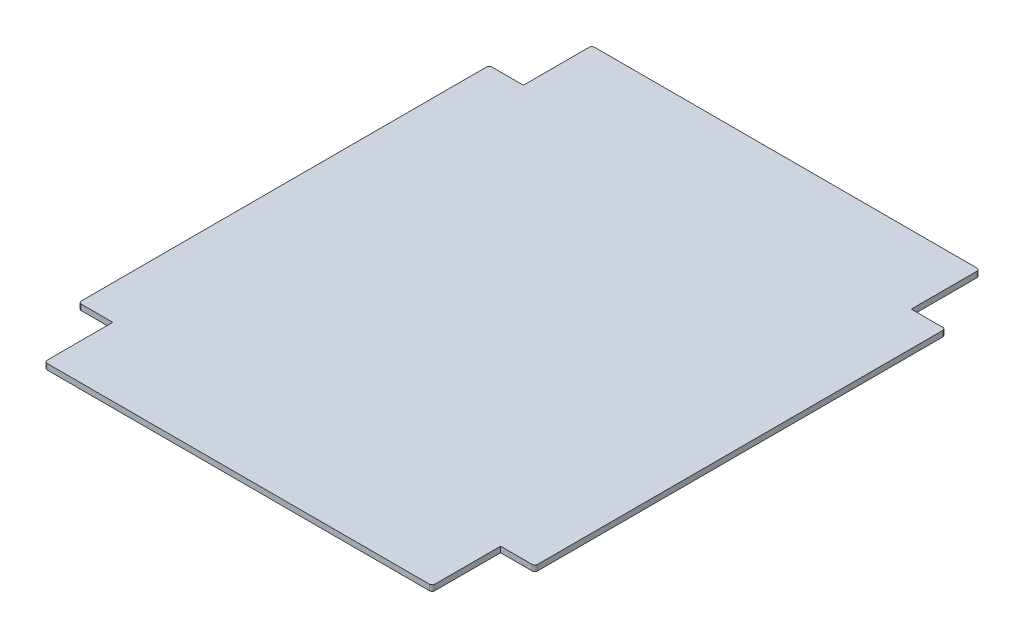
ISO-10303-21;
HEADER;
FILE_DESCRIPTION(('STEP AP214'),'2;1');
FILE_NAME('part.step','',(''),(''),'','','');
FILE_SCHEMA(('AUTOMOTIVE_DESIGN { 1 0 10303 214 1 1 1 1 }'));
ENDSEC;
DATA;
#1=APPLICATION_CONTEXT('core data for automotive mechanical design processes');
#2=APPLICATION_PROTOCOL_DEFINITION('international standard','automotive_design',2000,#1);
#3=PRODUCT_CONTEXT('',#1,'mechanical');
#4=PRODUCT('Part','Part','',(#3));
#5=PRODUCT_RELATED_PRODUCT_CATEGORY('part','',(#4));
#6=PRODUCT_DEFINITION_FORMATION('','',#4);
#7=PRODUCT_DEFINITION_CONTEXT('part definition',#1,'design');
#8=PRODUCT_DEFINITION('design','',#6,#7);
#9=PRODUCT_DEFINITION_SHAPE('','',#8);
#10=(LENGTH_UNIT() NAMED_UNIT(*) SI_UNIT(.MILLI.,.METRE.));
#11=(NAMED_UNIT(*) PLANE_ANGLE_UNIT() SI_UNIT($,.RADIAN.));
#12=(NAMED_UNIT(*) SI_UNIT($,.STERADIAN.) SOLID_ANGLE_UNIT());
#13=UNCERTAINTY_MEASURE_WITH_UNIT(LENGTH_MEASURE(1.E-05),#10,'distance_accuracy_value','');
#14=(GEOMETRIC_REPRESENTATION_CONTEXT(3) GLOBAL_UNCERTAINTY_ASSIGNED_CONTEXT((#13)) GLOBAL_UNIT_ASSIGNED_CONTEXT((#10,
#11,#12)) REPRESENTATION_CONTEXT('',''));
#15=CARTESIAN_POINT('',(0.,0.,0.));
#16=DIRECTION('',(0.,0.,1.));
#17=DIRECTION('',(1.,0.,0.));
#18=AXIS2_PLACEMENT_3D('',#15,#16,#17);
#19=CARTESIAN_POINT('',(-215.9,6.35,304.8));
#20=DIRECTION('',(1.,0.,0.));
#21=DIRECTION('',(0.,0.,-1.));
#22=AXIS2_PLACEMENT_3D('',#19,#20,#21);
#23=PLANE('',#22);
#24=DIRECTION('',(0.,0.,1.));
#25=VECTOR('',#24,1.);
#26=CARTESIAN_POINT('',(-215.9,0.,304.8));
#27=LINE('',#26,#25);
#28=CARTESIAN_POINT('',(-215.9,0.,228.6));
#29=VERTEX_POINT('',#28);
#30=CARTESIAN_POINT('',(-215.9,0.,301.625));
#31=VERTEX_POINT('',#30);
#32=EDGE_CURVE('E231',#29,#31,#27,.T.);
#33=ORIENTED_EDGE('',*,*,#32,.T.);
#34=DIRECTION('',(0.,-1.,0.));
#35=VECTOR('',#34,1.);
#36=CARTESIAN_POINT('',(-215.9,6.35,301.625));
#37=LINE('',#36,#35);
#38=CARTESIAN_POINT('',(-215.9,6.35,301.625));
#39=VERTEX_POINT('',#38);
#40=EDGE_CURVE('E329',#31,#39,#37,.F.);
#41=ORIENTED_EDGE('',*,*,#40,.T.);
#42=DIRECTION('',(0.,0.,1.));
#43=VECTOR('',#42,1.);
#44=CARTESIAN_POINT('',(-215.9,6.35,304.8));
#45=LINE('',#44,#43);
#46=CARTESIAN_POINT('',(-215.9,6.35,228.6));
#47=VERTEX_POINT('',#46);
#48=EDGE_CURVE('E260',#47,#39,#45,.T.);
#49=ORIENTED_EDGE('',*,*,#48,.F.);
#50=DIRECTION('',(0.,-1.,0.));
#51=VECTOR('',#50,1.);
#52=CARTESIAN_POINT('',(-215.9,6.35,228.6));
#53=LINE('',#52,#51);
#54=EDGE_CURVE('E230',#47,#29,#53,.T.);
#55=ORIENTED_EDGE('',*,*,#54,.T.);
#56=EDGE_LOOP('',(#33,#41,#49,#55));
#57=FACE_BOUND('',#56,.T.);
#58=ADVANCED_FACE('F43',(#57),#23,.F.);
#59=CARTESIAN_POINT('',(-215.9,6.35,304.8));
#60=DIRECTION('',(0.,0.,-1.));
#61=DIRECTION('',(-1.,0.,0.));
#62=AXIS2_PLACEMENT_3D('',#59,#60,#61);
#63=PLANE('',#62);
#64=DIRECTION('',(1.,0.,0.));
#65=VECTOR('',#64,1.);
#66=CARTESIAN_POINT('',(-215.9,6.35,304.8));
#67=LINE('',#66,#65);
#68=CARTESIAN_POINT('',(-212.725,6.35,304.8));
#69=VERTEX_POINT('',#68);
#70=CARTESIAN_POINT('',(212.725,6.35,304.8));
#71=VERTEX_POINT('',#70);
#72=EDGE_CURVE('E193',#69,#71,#67,.T.);
#73=ORIENTED_EDGE('',*,*,#72,.F.);
#74=DIRECTION('',(0.,-1.,0.));
#75=VECTOR('',#74,1.);
#76=CARTESIAN_POINT('',(-212.725,6.35,304.8));
#77=LINE('',#76,#75);
#78=CARTESIAN_POINT('',(-212.725,0.,304.8));
#79=VERTEX_POINT('',#78);
#80=EDGE_CURVE('E326',#69,#79,#77,.T.);
#81=ORIENTED_EDGE('',*,*,#80,.T.);
#82=DIRECTION('',(1.,0.,0.));
#83=VECTOR('',#82,1.);
#84=CARTESIAN_POINT('',(-215.9,0.,304.8));
#85=LINE('',#84,#83);
#86=CARTESIAN_POINT('',(212.725,0.,304.8));
#87=VERTEX_POINT('',#86);
#88=EDGE_CURVE('E234',#79,#87,#85,.T.);
#89=ORIENTED_EDGE('',*,*,#88,.T.);
#90=DIRECTION('',(0.,-1.,0.));
#91=VECTOR('',#90,1.);
#92=CARTESIAN_POINT('',(212.725,6.35,304.8));
#93=LINE('',#92,#91);
#94=EDGE_CURVE('E324',#87,#71,#93,.F.);
#95=ORIENTED_EDGE('',*,*,#94,.T.);
#96=EDGE_LOOP('',(#73,#81,#89,#95));
#97=FACE_BOUND('',#96,.T.);
#98=ADVANCED_FACE('F402',(#97),#63,.F.);
#99=CARTESIAN_POINT('',(215.9,6.35,304.8));
#100=DIRECTION('',(-1.,0.,0.));
#101=DIRECTION('',(0.,0.,1.));
#102=AXIS2_PLACEMENT_3D('',#99,#100,#101);
#103=PLANE('',#102);
#104=DIRECTION('',(0.,0.,-1.));
#105=VECTOR('',#104,1.);
#106=CARTESIAN_POINT('',(215.9,6.35,304.8));
#107=LINE('',#106,#105);
#108=CARTESIAN_POINT('',(215.9,6.35,301.625));
#109=VERTEX_POINT('',#108);
#110=CARTESIAN_POINT('',(215.9,6.35,228.6));
#111=VERTEX_POINT('',#110);
#112=EDGE_CURVE('E180',#109,#111,#107,.T.);
#113=ORIENTED_EDGE('',*,*,#112,.F.);
#114=DIRECTION('',(0.,-1.,0.));
#115=VECTOR('',#114,1.);
#116=CARTESIAN_POINT('',(215.9,6.35,301.625));
#117=LINE('',#116,#115);
#118=CARTESIAN_POINT('',(215.9,0.,301.625));
#119=VERTEX_POINT('',#118);
#120=EDGE_CURVE('E51',#109,#119,#117,.T.);
#121=ORIENTED_EDGE('',*,*,#120,.T.);
#122=DIRECTION('',(0.,0.,-1.));
#123=VECTOR('',#122,1.);
#124=CARTESIAN_POINT('',(215.9,0.,304.8));
#125=LINE('',#124,#123);
#126=CARTESIAN_POINT('',(215.9,0.,228.6));
#127=VERTEX_POINT('',#126);
#128=EDGE_CURVE('E199',#119,#127,#125,.T.);
#129=ORIENTED_EDGE('',*,*,#128,.T.);
#130=DIRECTION('',(0.,-1.,0.));
#131=VECTOR('',#130,1.);
#132=CARTESIAN_POINT('',(215.9,6.35,228.6));
#133=LINE('',#132,#131);
#134=EDGE_CURVE('E196',#111,#127,#133,.T.);
#135=ORIENTED_EDGE('',*,*,#134,.F.);
#136=EDGE_LOOP('',(#113,#121,#129,#135));
#137=FACE_BOUND('',#136,.T.);
#138=ADVANCED_FACE('F197',(#137),#103,.F.);
#139=CARTESIAN_POINT('',(254.,6.35,228.6));
#140=DIRECTION('',(0.,0.,-1.));
#141=DIRECTION('',(-1.,0.,0.));
#142=AXIS2_PLACEMENT_3D('',#139,#140,#141);
#143=PLANE('',#142);
#144=DIRECTION('',(1.,0.,0.));
#145=VECTOR('',#144,1.);
#146=CARTESIAN_POINT('',(254.,0.,228.6));
#147=LINE('',#146,#145);
#148=CARTESIAN_POINT('',(250.825,0.,228.6));
#149=VERTEX_POINT('',#148);
#150=EDGE_CURVE('E238',#127,#149,#147,.T.);
#151=ORIENTED_EDGE('',*,*,#150,.T.);
#152=DIRECTION('',(0.,-1.,0.));
#153=VECTOR('',#152,1.);
#154=CARTESIAN_POINT('',(250.825,6.35,228.6));
#155=LINE('',#154,#153);
#156=CARTESIAN_POINT('',(250.825,6.35,228.6));
#157=VERTEX_POINT('',#156);
#158=EDGE_CURVE('E11',#149,#157,#155,.F.);
#159=ORIENTED_EDGE('',*,*,#158,.T.);
#160=DIRECTION('',(1.,0.,0.));
#161=VECTOR('',#160,1.);
#162=CARTESIAN_POINT('',(254.,6.35,228.6));
#163=LINE('',#162,#161);
#164=EDGE_CURVE('E185',#111,#157,#163,.T.);
#165=ORIENTED_EDGE('',*,*,#164,.F.);
#166=ORIENTED_EDGE('',*,*,#134,.T.);
#167=EDGE_LOOP('',(#151,#159,#165,#166));
#168=FACE_BOUND('',#167,.T.);
#169=ADVANCED_FACE('F206',(#168),#143,.F.);
#170=CARTESIAN_POINT('',(254.,6.35,-228.6));
#171=DIRECTION('',(-1.,0.,0.));
#172=DIRECTION('',(0.,0.,1.));
#173=AXIS2_PLACEMENT_3D('',#170,#171,#172);
#174=PLANE('',#173);
#175=DIRECTION('',(0.,0.,-1.));
#176=VECTOR('',#175,1.);
#177=CARTESIAN_POINT('',(254.,0.,-228.6));
#178=LINE('',#177,#176);
#179=CARTESIAN_POINT('',(254.,0.,225.425));
#180=VERTEX_POINT('',#179);
#181=CARTESIAN_POINT('',(254.,0.,-225.425));
#182=VERTEX_POINT('',#181);
#183=EDGE_CURVE('E240',#180,#182,#178,.T.);
#184=ORIENTED_EDGE('',*,*,#183,.T.);
#185=DIRECTION('',(0.,-1.,0.));
#186=VECTOR('',#185,1.);
#187=CARTESIAN_POINT('',(254.,6.35,-225.425));
#188=LINE('',#187,#186);
#189=CARTESIAN_POINT('',(254.,6.35,-225.425));
#190=VERTEX_POINT('',#189);
#191=EDGE_CURVE('E319',#182,#190,#188,.F.);
#192=ORIENTED_EDGE('',*,*,#191,.T.);
#193=DIRECTION('',(0.,0.,-1.));
#194=VECTOR('',#193,1.);
#195=CARTESIAN_POINT('',(254.,6.35,-228.6));
#196=LINE('',#195,#194);
#197=CARTESIAN_POINT('',(254.,6.35,225.425));
#198=VERTEX_POINT('',#197);
#199=EDGE_CURVE('E208',#198,#190,#196,.T.);
#200=ORIENTED_EDGE('',*,*,#199,.F.);
#201=DIRECTION('',(0.,-1.,0.));
#202=VECTOR('',#201,1.);
#203=CARTESIAN_POINT('',(254.,6.35,225.425));
#204=LINE('',#203,#202);
#205=EDGE_CURVE('E316',#198,#180,#204,.T.);
#206=ORIENTED_EDGE('',*,*,#205,.T.);
#207=EDGE_LOOP('',(#184,#192,#200,#206));
#208=FACE_BOUND('',#207,.T.);
#209=ADVANCED_FACE('F341',(#208),#174,.F.);
#210=CARTESIAN_POINT('',(254.,6.35,-228.6));
#211=DIRECTION('',(0.,0.,1.));
#212=DIRECTION('',(1.,0.,0.));
#213=AXIS2_PLACEMENT_3D('',#210,#211,#212);
#214=PLANE('',#213);
#215=DIRECTION('',(-1.,0.,0.));
#216=VECTOR('',#215,1.);
#217=CARTESIAN_POINT('',(254.,6.35,-228.6));
#218=LINE('',#217,#216);
#219=CARTESIAN_POINT('',(250.825,6.35,-228.6));
#220=VERTEX_POINT('',#219);
#221=CARTESIAN_POINT('',(215.9,6.35,-228.6));
#222=VERTEX_POINT('',#221);
#223=EDGE_CURVE('E211',#220,#222,#218,.T.);
#224=ORIENTED_EDGE('',*,*,#223,.F.);
#225=DIRECTION('',(0.,-1.,0.));
#226=VECTOR('',#225,1.);
#227=CARTESIAN_POINT('',(250.825,6.35,-228.6));
#228=LINE('',#227,#226);
#229=CARTESIAN_POINT('',(250.825,0.,-228.6));
#230=VERTEX_POINT('',#229);
#231=EDGE_CURVE('E313',#220,#230,#228,.T.);
#232=ORIENTED_EDGE('',*,*,#231,.T.);
#233=DIRECTION('',(-1.,0.,0.));
#234=VECTOR('',#233,1.);
#235=CARTESIAN_POINT('',(254.,0.,-228.6));
#236=LINE('',#235,#234);
#237=CARTESIAN_POINT('',(215.9,0.,-228.6));
#238=VERTEX_POINT('',#237);
#239=EDGE_CURVE('E243',#230,#238,#236,.T.);
#240=ORIENTED_EDGE('',*,*,#239,.T.);
#241=DIRECTION('',(0.,-1.,0.));
#242=VECTOR('',#241,1.);
#243=CARTESIAN_POINT('',(215.9,6.35,-228.6));
#244=LINE('',#243,#242);
#245=EDGE_CURVE('E204',#222,#238,#244,.T.);
#246=ORIENTED_EDGE('',*,*,#245,.F.);
#247=EDGE_LOOP('',(#224,#232,#240,#246));
#248=FACE_BOUND('',#247,.T.);
#249=ADVANCED_FACE('F349',(#248),#214,.F.);
#250=CARTESIAN_POINT('',(215.9,6.35,-304.8));
#251=DIRECTION('',(-1.,0.,0.));
#252=DIRECTION('',(0.,0.,1.));
#253=AXIS2_PLACEMENT_3D('',#250,#251,#252);
#254=PLANE('',#253);
#255=DIRECTION('',(0.,0.,-1.));
#256=VECTOR('',#255,1.);
#257=CARTESIAN_POINT('',(215.9,0.,-304.8));
#258=LINE('',#257,#256);
#259=CARTESIAN_POINT('',(215.9,0.,-301.625));
#260=VERTEX_POINT('',#259);
#261=EDGE_CURVE('E245',#238,#260,#258,.T.);
#262=ORIENTED_EDGE('',*,*,#261,.T.);
#263=DIRECTION('',(0.,-1.,0.));
#264=VECTOR('',#263,1.);
#265=CARTESIAN_POINT('',(215.9,6.35,-301.625));
#266=LINE('',#265,#264);
#267=CARTESIAN_POINT('',(215.9,6.35,-301.625));
#268=VERTEX_POINT('',#267);
#269=EDGE_CURVE('E311',#260,#268,#266,.F.);
#270=ORIENTED_EDGE('',*,*,#269,.T.);
#271=DIRECTION('',(0.,0.,-1.));
#272=VECTOR('',#271,1.);
#273=CARTESIAN_POINT('',(215.9,6.35,-304.8));
#274=LINE('',#273,#272);
#275=EDGE_CURVE('E216',#222,#268,#274,.T.);
#276=ORIENTED_EDGE('',*,*,#275,.F.);
#277=ORIENTED_EDGE('',*,*,#245,.T.);
#278=EDGE_LOOP('',(#262,#270,#276,#277));
#279=FACE_BOUND('',#278,.T.);
#280=ADVANCED_FACE('F354',(#279),#254,.F.);
#281=CARTESIAN_POINT('',(-215.9,6.35,-304.8));
#282=DIRECTION('',(0.,0.,1.));
#283=DIRECTION('',(1.,0.,0.));
#284=AXIS2_PLACEMENT_3D('',#281,#282,#283);
#285=PLANE('',#284);
#286=DIRECTION('',(-1.,0.,0.));
#287=VECTOR('',#286,1.);
#288=CARTESIAN_POINT('',(-215.9,0.,-304.8));
#289=LINE('',#288,#287);
#290=CARTESIAN_POINT('',(212.725,0.,-304.8));
#291=VERTEX_POINT('',#290);
#292=CARTESIAN_POINT('',(-212.725,0.,-304.8));
#293=VERTEX_POINT('',#292);
#294=EDGE_CURVE('E248',#291,#293,#289,.T.);
#295=ORIENTED_EDGE('',*,*,#294,.T.);
#296=DIRECTION('',(0.,-1.,0.));
#297=VECTOR('',#296,1.);
#298=CARTESIAN_POINT('',(-212.725,6.35,-304.8));
#299=LINE('',#298,#297);
#300=CARTESIAN_POINT('',(-212.725,6.35,-304.8));
#301=VERTEX_POINT('',#300);
#302=EDGE_CURVE('E289',#293,#301,#299,.F.);
#303=ORIENTED_EDGE('',*,*,#302,.T.);
#304=DIRECTION('',(-1.,0.,0.));
#305=VECTOR('',#304,1.);
#306=CARTESIAN_POINT('',(-215.9,6.35,-304.8));
#307=LINE('',#306,#305);
#308=CARTESIAN_POINT('',(212.725,6.35,-304.8));
#309=VERTEX_POINT('',#308);
#310=EDGE_CURVE('E219',#309,#301,#307,.T.);
#311=ORIENTED_EDGE('',*,*,#310,.F.);
#312=DIRECTION('',(0.,-1.,0.));
#313=VECTOR('',#312,1.);
#314=CARTESIAN_POINT('',(212.725,6.35,-304.8));
#315=LINE('',#314,#313);
#316=EDGE_CURVE('E286',#309,#291,#315,.T.);
#317=ORIENTED_EDGE('',*,*,#316,.T.);
#318=EDGE_LOOP('',(#295,#303,#311,#317));
#319=FACE_BOUND('',#318,.T.);
#320=ADVANCED_FACE('F363',(#319),#285,.F.);
#321=CARTESIAN_POINT('',(-215.9,6.35,-304.8));
#322=DIRECTION('',(1.,0.,0.));
#323=DIRECTION('',(0.,0.,-1.));
#324=AXIS2_PLACEMENT_3D('',#321,#322,#323);
#325=PLANE('',#324);
#326=DIRECTION('',(0.,0.,1.));
#327=VECTOR('',#326,1.);
#328=CARTESIAN_POINT('',(-215.9,6.35,-304.8));
#329=LINE('',#328,#327);
#330=CARTESIAN_POINT('',(-215.9,6.35,-301.625));
#331=VERTEX_POINT('',#330);
#332=CARTESIAN_POINT('',(-215.9,6.35,-228.6));
#333=VERTEX_POINT('',#332);
#334=EDGE_CURVE('E221',#331,#333,#329,.T.);
#335=ORIENTED_EDGE('',*,*,#334,.F.);
#336=DIRECTION('',(0.,-1.,0.));
#337=VECTOR('',#336,1.);
#338=CARTESIAN_POINT('',(-215.9,6.35,-301.625));
#339=LINE('',#338,#337);
#340=CARTESIAN_POINT('',(-215.9,0.,-301.625));
#341=VERTEX_POINT('',#340);
#342=EDGE_CURVE('E203',#331,#341,#339,.T.);
#343=ORIENTED_EDGE('',*,*,#342,.T.);
#344=DIRECTION('',(0.,0.,1.));
#345=VECTOR('',#344,1.);
#346=CARTESIAN_POINT('',(-215.9,0.,-304.8));
#347=LINE('',#346,#345);
#348=CARTESIAN_POINT('',(-215.9,0.,-228.6));
#349=VERTEX_POINT('',#348);
#350=EDGE_CURVE('E251',#341,#349,#347,.T.);
#351=ORIENTED_EDGE('',*,*,#350,.T.);
#352=DIRECTION('',(0.,-1.,0.));
#353=VECTOR('',#352,1.);
#354=CARTESIAN_POINT('',(-215.9,6.35,-228.6));
#355=LINE('',#354,#353);
#356=EDGE_CURVE('E263',#333,#349,#355,.T.);
#357=ORIENTED_EDGE('',*,*,#356,.F.);
#358=EDGE_LOOP('',(#335,#343,#351,#357));
#359=FACE_BOUND('',#358,.T.);
#360=ADVANCED_FACE('F372',(#359),#325,.F.);
#361=CARTESIAN_POINT('',(-254.,6.35,-228.6));
#362=DIRECTION('',(0.,0.,1.));
#363=DIRECTION('',(1.,0.,0.));
#364=AXIS2_PLACEMENT_3D('',#361,#362,#363);
#365=PLANE('',#364);
#366=DIRECTION('',(-1.,0.,0.));
#367=VECTOR('',#366,1.);
#368=CARTESIAN_POINT('',(-254.,0.,-228.6));
#369=LINE('',#368,#367);
#370=CARTESIAN_POINT('',(-250.825,0.,-228.6));
#371=VERTEX_POINT('',#370);
#372=EDGE_CURVE('E253',#349,#371,#369,.T.);
#373=ORIENTED_EDGE('',*,*,#372,.T.);
#374=DIRECTION('',(0.,-1.,0.));
#375=VECTOR('',#374,1.);
#376=CARTESIAN_POINT('',(-250.825,6.35,-228.6));
#377=LINE('',#376,#375);
#378=CARTESIAN_POINT('',(-250.825,6.35,-228.6));
#379=VERTEX_POINT('',#378);
#380=EDGE_CURVE('E309',#371,#379,#377,.F.);
#381=ORIENTED_EDGE('',*,*,#380,.T.);
#382=DIRECTION('',(-1.,0.,0.));
#383=VECTOR('',#382,1.);
#384=CARTESIAN_POINT('',(-254.,6.35,-228.6));
#385=LINE('',#384,#383);
#386=EDGE_CURVE('E223',#333,#379,#385,.T.);
#387=ORIENTED_EDGE('',*,*,#386,.F.);
#388=ORIENTED_EDGE('',*,*,#356,.T.);
#389=EDGE_LOOP('',(#373,#381,#387,#388));
#390=FACE_BOUND('',#389,.T.);
#391=ADVANCED_FACE('F504',(#390),#365,.F.);
#392=CARTESIAN_POINT('',(-254.,6.35,-228.6));
#393=DIRECTION('',(1.,0.,0.));
#394=DIRECTION('',(0.,0.,-1.));
#395=AXIS2_PLACEMENT_3D('',#392,#393,#394);
#396=PLANE('',#395);
#397=DIRECTION('',(0.,0.,1.));
#398=VECTOR('',#397,1.);
#399=CARTESIAN_POINT('',(-254.,6.35,-228.6));
#400=LINE('',#399,#398);
#401=CARTESIAN_POINT('',(-254.,6.35,-225.425));
#402=VERTEX_POINT('',#401);
#403=CARTESIAN_POINT('',(-254.,6.35,225.425));
#404=VERTEX_POINT('',#403);
#405=EDGE_CURVE('E226',#402,#404,#400,.T.);
#406=ORIENTED_EDGE('',*,*,#405,.F.);
#407=DIRECTION('',(0.,-1.,0.));
#408=VECTOR('',#407,1.);
#409=CARTESIAN_POINT('',(-254.,6.35,-225.425));
#410=LINE('',#409,#408);
#411=CARTESIAN_POINT('',(-254.,0.,-225.425));
#412=VERTEX_POINT('',#411);
#413=EDGE_CURVE('E306',#402,#412,#410,.T.);
#414=ORIENTED_EDGE('',*,*,#413,.T.);
#415=DIRECTION('',(0.,0.,1.));
#416=VECTOR('',#415,1.);
#417=CARTESIAN_POINT('',(-254.,0.,-228.6));
#418=LINE('',#417,#416);
#419=CARTESIAN_POINT('',(-254.,0.,225.425));
#420=VERTEX_POINT('',#419);
#421=EDGE_CURVE('E256',#412,#420,#418,.T.);
#422=ORIENTED_EDGE('',*,*,#421,.T.);
#423=DIRECTION('',(0.,-1.,0.));
#424=VECTOR('',#423,1.);
#425=CARTESIAN_POINT('',(-254.,6.35,225.425));
#426=LINE('',#425,#424);
#427=EDGE_CURVE('E66',#420,#404,#426,.F.);
#428=ORIENTED_EDGE('',*,*,#427,.T.);
#429=EDGE_LOOP('',(#406,#414,#422,#428));
#430=FACE_BOUND('',#429,.T.);
#431=ADVANCED_FACE('F382',(#430),#396,.F.);
#432=CARTESIAN_POINT('',(-254.,6.35,228.6));
#433=DIRECTION('',(0.,0.,-1.));
#434=DIRECTION('',(-1.,0.,0.));
#435=AXIS2_PLACEMENT_3D('',#432,#433,#434);
#436=PLANE('',#435);
#437=DIRECTION('',(1.,0.,0.));
#438=VECTOR('',#437,1.);
#439=CARTESIAN_POINT('',(-254.,6.35,228.6));
#440=LINE('',#439,#438);
#441=CARTESIAN_POINT('',(-250.825,6.35,228.6));
#442=VERTEX_POINT('',#441);
#443=EDGE_CURVE('E228',#442,#47,#440,.T.);
#444=ORIENTED_EDGE('',*,*,#443,.F.);
#445=DIRECTION('',(0.,-1.,0.));
#446=VECTOR('',#445,1.);
#447=CARTESIAN_POINT('',(-250.825,6.35,228.6));
#448=LINE('',#447,#446);
#449=CARTESIAN_POINT('',(-250.825,0.,228.6));
#450=VERTEX_POINT('',#449);
#451=EDGE_CURVE('E321',#442,#450,#448,.T.);
#452=ORIENTED_EDGE('',*,*,#451,.T.);
#453=DIRECTION('',(1.,0.,0.));
#454=VECTOR('',#453,1.);
#455=CARTESIAN_POINT('',(-254.,0.,228.6));
#456=LINE('',#455,#454);
#457=EDGE_CURVE('E258',#450,#29,#456,.T.);
#458=ORIENTED_EDGE('',*,*,#457,.T.);
#459=ORIENTED_EDGE('',*,*,#54,.F.);
#460=EDGE_LOOP('',(#444,#452,#458,#459));
#461=FACE_BOUND('',#460,.T.);
#462=ADVANCED_FACE('F389',(#461),#436,.F.);
#463=CARTESIAN_POINT('',(0.,6.35,0.));
#464=DIRECTION('',(0.,-1.,0.));
#465=DIRECTION('',(0.,0.,-1.));
#466=AXIS2_PLACEMENT_3D('',#463,#464,#465);
#467=PLANE('',#466);
#468=ORIENTED_EDGE('',*,*,#310,.T.);
#469=CARTESIAN_POINT('',(-212.725,6.35,-301.625));
#470=DIRECTION('',(0.,-1.,0.));
#471=DIRECTION('',(0.,0.,-1.));
#472=AXIS2_PLACEMENT_3D('',#469,#470,#471);
#473=CIRCLE('',#472,3.175);
#474=EDGE_CURVE('E303',#301,#331,#473,.F.);
#475=ORIENTED_EDGE('',*,*,#474,.T.);
#476=ORIENTED_EDGE('',*,*,#334,.T.);
#477=ORIENTED_EDGE('',*,*,#386,.T.);
#478=CARTESIAN_POINT('',(-250.825,6.35,-225.425));
#479=DIRECTION('',(0.,-1.,0.));
#480=DIRECTION('',(0.,0.,-1.));
#481=AXIS2_PLACEMENT_3D('',#478,#479,#480);
#482=CIRCLE('',#481,3.175);
#483=EDGE_CURVE('E301',#379,#402,#482,.F.);
#484=ORIENTED_EDGE('',*,*,#483,.T.);
#485=ORIENTED_EDGE('',*,*,#405,.T.);
#486=CARTESIAN_POINT('',(-250.825,6.35,225.425));
#487=DIRECTION('',(0.,-1.,0.));
#488=DIRECTION('',(0.,0.,-1.));
#489=AXIS2_PLACEMENT_3D('',#486,#487,#488);
#490=CIRCLE('',#489,3.175);
#491=EDGE_CURVE('E58',#404,#442,#490,.F.);
#492=ORIENTED_EDGE('',*,*,#491,.T.);
#493=ORIENTED_EDGE('',*,*,#443,.T.);
#494=ORIENTED_EDGE('',*,*,#48,.T.);
#495=CARTESIAN_POINT('',(-212.725,6.35,301.625));
#496=DIRECTION('',(0.,-1.,0.));
#497=DIRECTION('',(0.,0.,-1.));
#498=AXIS2_PLACEMENT_3D('',#495,#496,#497);
#499=CIRCLE('',#498,3.175);
#500=EDGE_CURVE('E294',#39,#69,#499,.F.);
#501=ORIENTED_EDGE('',*,*,#500,.T.);
#502=ORIENTED_EDGE('',*,*,#72,.T.);
#503=CARTESIAN_POINT('',(212.725,6.35,301.625));
#504=DIRECTION('',(0.,-1.,0.));
#505=DIRECTION('',(0.,0.,-1.));
#506=AXIS2_PLACEMENT_3D('',#503,#504,#505);
#507=CIRCLE('',#506,3.175);
#508=EDGE_CURVE('E189',#71,#109,#507,.F.);
#509=ORIENTED_EDGE('',*,*,#508,.T.);
#510=ORIENTED_EDGE('',*,*,#112,.T.);
#511=ORIENTED_EDGE('',*,*,#164,.T.);
#512=CARTESIAN_POINT('',(250.825,6.35,225.425));
#513=DIRECTION('',(0.,-1.,0.));
#514=DIRECTION('',(0.,0.,-1.));
#515=AXIS2_PLACEMENT_3D('',#512,#513,#514);
#516=CIRCLE('',#515,3.175);
#517=EDGE_CURVE('E291',#157,#198,#516,.F.);
#518=ORIENTED_EDGE('',*,*,#517,.T.);
#519=ORIENTED_EDGE('',*,*,#199,.T.);
#520=CARTESIAN_POINT('',(250.825,6.35,-225.425));
#521=DIRECTION('',(0.,-1.,0.));
#522=DIRECTION('',(0.,0.,-1.));
#523=AXIS2_PLACEMENT_3D('',#520,#521,#522);
#524=CIRCLE('',#523,3.175);
#525=EDGE_CURVE('E297',#190,#220,#524,.F.);
#526=ORIENTED_EDGE('',*,*,#525,.T.);
#527=ORIENTED_EDGE('',*,*,#223,.T.);
#528=ORIENTED_EDGE('',*,*,#275,.T.);
#529=CARTESIAN_POINT('',(212.725,6.35,-301.625));
#530=DIRECTION('',(0.,-1.,0.));
#531=DIRECTION('',(0.,0.,-1.));
#532=AXIS2_PLACEMENT_3D('',#529,#530,#531);
#533=CIRCLE('',#532,3.175);
#534=EDGE_CURVE('E299',#268,#309,#533,.F.);
#535=ORIENTED_EDGE('',*,*,#534,.T.);
#536=EDGE_LOOP('',(#468,#475,#476,#477,#484,#485,#492,#493,#494,#501,#502,#509,#510,#511,#518,
#519,#526,#527,#528,#535));
#537=FACE_BOUND('',#536,.T.);
#538=ADVANCED_FACE('F183',(#537),#467,.F.);
#539=CARTESIAN_POINT('',(0.,0.,0.));
#540=DIRECTION('',(0.,-1.,0.));
#541=DIRECTION('',(0.,0.,-1.));
#542=AXIS2_PLACEMENT_3D('',#539,#540,#541);
#543=PLANE('',#542);
#544=ORIENTED_EDGE('',*,*,#350,.F.);
#545=CARTESIAN_POINT('',(-212.725,0.,-301.625));
#546=DIRECTION('',(0.,-1.,0.));
#547=DIRECTION('',(0.,0.,-1.));
#548=AXIS2_PLACEMENT_3D('',#545,#546,#547);
#549=CIRCLE('',#548,3.175);
#550=EDGE_CURVE('E284',#341,#293,#549,.T.);
#551=ORIENTED_EDGE('',*,*,#550,.T.);
#552=ORIENTED_EDGE('',*,*,#294,.F.);
#553=CARTESIAN_POINT('',(212.725,0.,-301.625));
#554=DIRECTION('',(0.,-1.,0.));
#555=DIRECTION('',(0.,0.,-1.));
#556=AXIS2_PLACEMENT_3D('',#553,#554,#555);
#557=CIRCLE('',#556,3.175);
#558=EDGE_CURVE('E280',#291,#260,#557,.T.);
#559=ORIENTED_EDGE('',*,*,#558,.T.);
#560=ORIENTED_EDGE('',*,*,#261,.F.);
#561=ORIENTED_EDGE('',*,*,#239,.F.);
#562=CARTESIAN_POINT('',(250.825,0.,-225.425));
#563=DIRECTION('',(0.,-1.,0.));
#564=DIRECTION('',(0.,0.,-1.));
#565=AXIS2_PLACEMENT_3D('',#562,#563,#564);
#566=CIRCLE('',#565,3.175);
#567=EDGE_CURVE('E278',#230,#182,#566,.T.);
#568=ORIENTED_EDGE('',*,*,#567,.T.);
#569=ORIENTED_EDGE('',*,*,#183,.F.);
#570=CARTESIAN_POINT('',(250.825,0.,225.425));
#571=DIRECTION('',(0.,-1.,0.));
#572=DIRECTION('',(0.,0.,-1.));
#573=AXIS2_PLACEMENT_3D('',#570,#571,#572);
#574=CIRCLE('',#573,3.175);
#575=EDGE_CURVE('E270',#180,#149,#574,.T.);
#576=ORIENTED_EDGE('',*,*,#575,.T.);
#577=ORIENTED_EDGE('',*,*,#150,.F.);
#578=ORIENTED_EDGE('',*,*,#128,.F.);
#579=CARTESIAN_POINT('',(212.725,0.,301.625));
#580=DIRECTION('',(0.,-1.,0.));
#581=DIRECTION('',(0.,0.,-1.));
#582=AXIS2_PLACEMENT_3D('',#579,#580,#581);
#583=CIRCLE('',#582,3.175);
#584=EDGE_CURVE('E272',#119,#87,#583,.T.);
#585=ORIENTED_EDGE('',*,*,#584,.T.);
#586=ORIENTED_EDGE('',*,*,#88,.F.);
#587=CARTESIAN_POINT('',(-212.725,0.,301.625));
#588=DIRECTION('',(0.,-1.,0.));
#589=DIRECTION('',(0.,0.,-1.));
#590=AXIS2_PLACEMENT_3D('',#587,#588,#589);
#591=CIRCLE('',#590,3.175);
#592=EDGE_CURVE('E274',#79,#31,#591,.T.);
#593=ORIENTED_EDGE('',*,*,#592,.T.);
#594=ORIENTED_EDGE('',*,*,#32,.F.);
#595=ORIENTED_EDGE('',*,*,#457,.F.);
#596=CARTESIAN_POINT('',(-250.825,0.,225.425));
#597=DIRECTION('',(0.,-1.,0.));
#598=DIRECTION('',(0.,0.,-1.));
#599=AXIS2_PLACEMENT_3D('',#596,#597,#598);
#600=CIRCLE('',#599,3.175);
#601=EDGE_CURVE('E276',#450,#420,#600,.T.);
#602=ORIENTED_EDGE('',*,*,#601,.T.);
#603=ORIENTED_EDGE('',*,*,#421,.F.);
#604=CARTESIAN_POINT('',(-250.825,0.,-225.425));
#605=DIRECTION('',(0.,-1.,0.));
#606=DIRECTION('',(0.,0.,-1.));
#607=AXIS2_PLACEMENT_3D('',#604,#605,#606);
#608=CIRCLE('',#607,3.175);
#609=EDGE_CURVE('E282',#412,#371,#608,.T.);
#610=ORIENTED_EDGE('',*,*,#609,.T.);
#611=ORIENTED_EDGE('',*,*,#372,.F.);
#612=EDGE_LOOP('',(#544,#551,#552,#559,#560,#561,#568,#569,#576,#577,#578,#585,#586,#593,#594,
#595,#602,#603,#610,#611));
#613=FACE_BOUND('',#612,.T.);
#614=ADVANCED_FACE('F333',(#613),#543,.T.);
#615=CARTESIAN_POINT('',(-212.725,6.35,-301.625));
#616=DIRECTION('',(0.,-1.,0.));
#617=DIRECTION('',(0.,0.,-1.));
#618=AXIS2_PLACEMENT_3D('',#615,#616,#617);
#619=CYLINDRICAL_SURFACE('',#618,3.175);
#620=ORIENTED_EDGE('',*,*,#474,.F.);
#621=ORIENTED_EDGE('',*,*,#302,.F.);
#622=ORIENTED_EDGE('',*,*,#550,.F.);
#623=ORIENTED_EDGE('',*,*,#342,.F.);
#624=EDGE_LOOP('',(#620,#621,#622,#623));
#625=FACE_BOUND('',#624,.T.);
#626=ADVANCED_FACE('F369',(#625),#619,.T.);
#627=CARTESIAN_POINT('',(-250.825,6.35,-225.425));
#628=DIRECTION('',(0.,-1.,0.));
#629=DIRECTION('',(0.,0.,-1.));
#630=AXIS2_PLACEMENT_3D('',#627,#628,#629);
#631=CYLINDRICAL_SURFACE('',#630,3.175);
#632=ORIENTED_EDGE('',*,*,#483,.F.);
#633=ORIENTED_EDGE('',*,*,#380,.F.);
#634=ORIENTED_EDGE('',*,*,#609,.F.);
#635=ORIENTED_EDGE('',*,*,#413,.F.);
#636=EDGE_LOOP('',(#632,#633,#634,#635));
#637=FACE_BOUND('',#636,.T.);
#638=ADVANCED_FACE('F380',(#637),#631,.T.);
#639=CARTESIAN_POINT('',(212.725,6.35,-301.625));
#640=DIRECTION('',(0.,-1.,0.));
#641=DIRECTION('',(0.,0.,-1.));
#642=AXIS2_PLACEMENT_3D('',#639,#640,#641);
#643=CYLINDRICAL_SURFACE('',#642,3.175);
#644=ORIENTED_EDGE('',*,*,#534,.F.);
#645=ORIENTED_EDGE('',*,*,#269,.F.);
#646=ORIENTED_EDGE('',*,*,#558,.F.);
#647=ORIENTED_EDGE('',*,*,#316,.F.);
#648=EDGE_LOOP('',(#644,#645,#646,#647));
#649=FACE_BOUND('',#648,.T.);
#650=ADVANCED_FACE('F360',(#649),#643,.T.);
#651=CARTESIAN_POINT('',(250.825,6.35,-225.425));
#652=DIRECTION('',(0.,-1.,0.));
#653=DIRECTION('',(0.,0.,-1.));
#654=AXIS2_PLACEMENT_3D('',#651,#652,#653);
#655=CYLINDRICAL_SURFACE('',#654,3.175);
#656=ORIENTED_EDGE('',*,*,#525,.F.);
#657=ORIENTED_EDGE('',*,*,#191,.F.);
#658=ORIENTED_EDGE('',*,*,#567,.F.);
#659=ORIENTED_EDGE('',*,*,#231,.F.);
#660=EDGE_LOOP('',(#656,#657,#658,#659));
#661=FACE_BOUND('',#660,.T.);
#662=ADVANCED_FACE('F344',(#661),#655,.T.);
#663=CARTESIAN_POINT('',(-250.825,6.35,225.425));
#664=DIRECTION('',(0.,-1.,0.));
#665=DIRECTION('',(0.,0.,-1.));
#666=AXIS2_PLACEMENT_3D('',#663,#664,#665);
#667=CYLINDRICAL_SURFACE('',#666,3.175);
#668=ORIENTED_EDGE('',*,*,#491,.F.);
#669=ORIENTED_EDGE('',*,*,#427,.F.);
#670=ORIENTED_EDGE('',*,*,#601,.F.);
#671=ORIENTED_EDGE('',*,*,#451,.F.);
#672=EDGE_LOOP('',(#668,#669,#670,#671));
#673=FACE_BOUND('',#672,.T.);
#674=ADVANCED_FACE('F387',(#673),#667,.T.);
#675=CARTESIAN_POINT('',(-212.725,6.35,301.625));
#676=DIRECTION('',(0.,-1.,0.));
#677=DIRECTION('',(0.,0.,-1.));
#678=AXIS2_PLACEMENT_3D('',#675,#676,#677);
#679=CYLINDRICAL_SURFACE('',#678,3.175);
#680=ORIENTED_EDGE('',*,*,#500,.F.);
#681=ORIENTED_EDGE('',*,*,#40,.F.);
#682=ORIENTED_EDGE('',*,*,#592,.F.);
#683=ORIENTED_EDGE('',*,*,#80,.F.);
#684=EDGE_LOOP('',(#680,#681,#682,#683));
#685=FACE_BOUND('',#684,.T.);
#686=ADVANCED_FACE('F400',(#685),#679,.T.);
#687=CARTESIAN_POINT('',(212.725,6.35,301.625));
#688=DIRECTION('',(0.,-1.,0.));
#689=DIRECTION('',(0.,0.,-1.));
#690=AXIS2_PLACEMENT_3D('',#687,#688,#689);
#691=CYLINDRICAL_SURFACE('',#690,3.175);
#692=ORIENTED_EDGE('',*,*,#508,.F.);
#693=ORIENTED_EDGE('',*,*,#94,.F.);
#694=ORIENTED_EDGE('',*,*,#584,.F.);
#695=ORIENTED_EDGE('',*,*,#120,.F.);
#696=EDGE_LOOP('',(#692,#693,#694,#695));
#697=FACE_BOUND('',#696,.T.);
#698=ADVANCED_FACE('F423',(#697),#691,.T.);
#699=CARTESIAN_POINT('',(250.825,6.35,225.425));
#700=DIRECTION('',(0.,-1.,0.));
#701=DIRECTION('',(0.,0.,-1.));
#702=AXIS2_PLACEMENT_3D('',#699,#700,#701);
#703=CYLINDRICAL_SURFACE('',#702,3.175);
#704=ORIENTED_EDGE('',*,*,#517,.F.);
#705=ORIENTED_EDGE('',*,*,#158,.F.);
#706=ORIENTED_EDGE('',*,*,#575,.F.);
#707=ORIENTED_EDGE('',*,*,#205,.F.);
#708=EDGE_LOOP('',(#704,#705,#706,#707));
#709=FACE_BOUND('',#708,.T.);
#710=ADVANCED_FACE('F45',(#709),#703,.T.);
#711=CLOSED_SHELL('',(#58,#98,#138,#169,#209,#249,#280,#320,#360,#391,#431,#462,#538,#614,#626,
#638,#650,#662,#674,#686,#698,#710));
#712=MANIFOLD_SOLID_BREP('B2',#711);
#713=ADVANCED_BREP_SHAPE_REPRESENTATION('',(#18,#712),#14);
#714=SHAPE_DEFINITION_REPRESENTATION(#9,#713);
ENDSEC;
END-ISO-10303-21;
